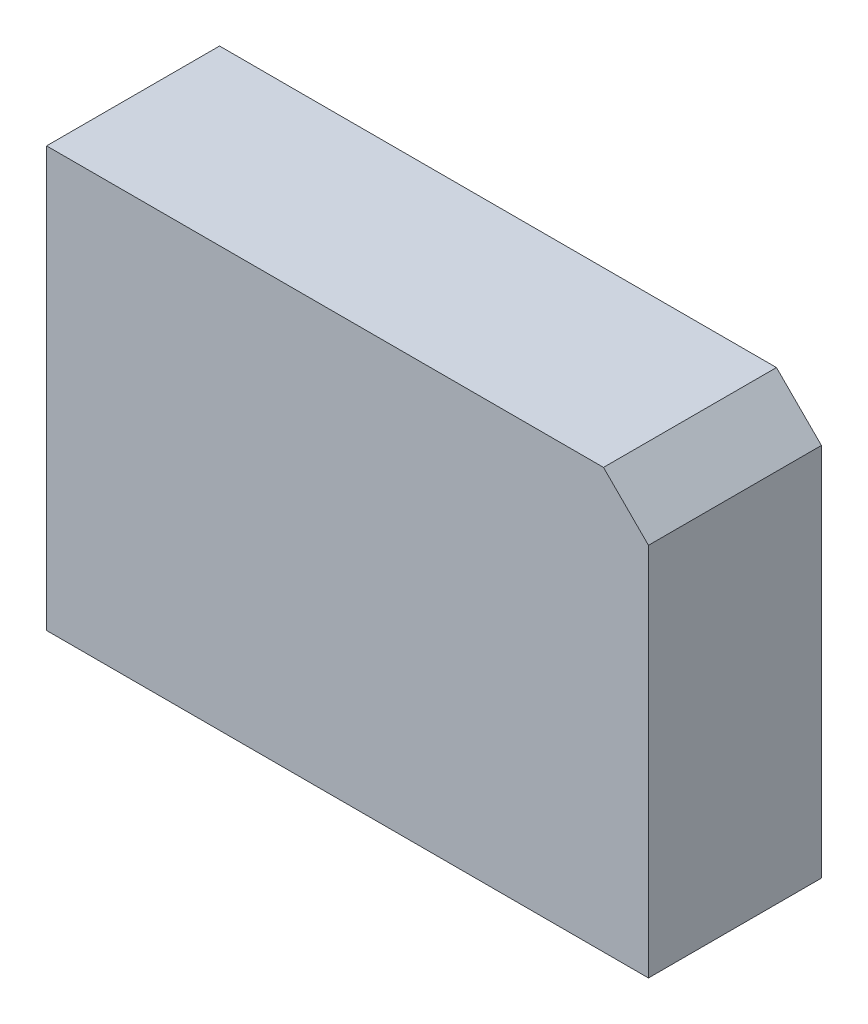
ISO-10303-21;
HEADER;
FILE_DESCRIPTION(('STEP AP214'),'2;1');
FILE_NAME('part.step','',(''),(''),'','','');
FILE_SCHEMA(('AUTOMOTIVE_DESIGN { 1 0 10303 214 1 1 1 1 }'));
ENDSEC;
DATA;
#1=APPLICATION_CONTEXT('core data for automotive mechanical design processes');
#2=APPLICATION_PROTOCOL_DEFINITION('international standard','automotive_design',2000,#1);
#3=PRODUCT_CONTEXT('',#1,'mechanical');
#4=PRODUCT('Part','Part','',(#3));
#5=PRODUCT_RELATED_PRODUCT_CATEGORY('part','',(#4));
#6=PRODUCT_DEFINITION_FORMATION('','',#4);
#7=PRODUCT_DEFINITION_CONTEXT('part definition',#1,'design');
#8=PRODUCT_DEFINITION('design','',#6,#7);
#9=PRODUCT_DEFINITION_SHAPE('','',#8);
#10=(LENGTH_UNIT() NAMED_UNIT(*) SI_UNIT(.MILLI.,.METRE.));
#11=(NAMED_UNIT(*) PLANE_ANGLE_UNIT() SI_UNIT($,.RADIAN.));
#12=(NAMED_UNIT(*) SI_UNIT($,.STERADIAN.) SOLID_ANGLE_UNIT());
#13=UNCERTAINTY_MEASURE_WITH_UNIT(LENGTH_MEASURE(1.E-05),#10,'distance_accuracy_value','');
#14=(GEOMETRIC_REPRESENTATION_CONTEXT(3) GLOBAL_UNCERTAINTY_ASSIGNED_CONTEXT((#13)) GLOBAL_UNIT_ASSIGNED_CONTEXT((#10,
#11,#12)) REPRESENTATION_CONTEXT('',''));
#15=CARTESIAN_POINT('',(0.,0.,0.));
#16=DIRECTION('',(0.,0.,1.));
#17=DIRECTION('',(1.,0.,0.));
#18=AXIS2_PLACEMENT_3D('',#15,#16,#17);
#19=CARTESIAN_POINT('',(-21.375,-30.875,18.75));
#20=DIRECTION('',(1.,0.,0.));
#21=DIRECTION('',(0.,0.,-1.));
#22=AXIS2_PLACEMENT_3D('',#19,#20,#21);
#23=PLANE('',#22);
#24=DIRECTION('',(0.,-1.,0.));
#25=VECTOR('',#24,1.);
#26=CARTESIAN_POINT('',(-21.375,-30.875,0.));
#27=LINE('',#26,#25);
#28=CARTESIAN_POINT('',(-21.375,14.625,0.));
#29=VERTEX_POINT('',#28);
#30=CARTESIAN_POINT('',(-21.375,-30.875,0.));
#31=VERTEX_POINT('',#30);
#32=EDGE_CURVE('E113',#29,#31,#27,.T.);
#33=ORIENTED_EDGE('',*,*,#32,.T.);
#34=DIRECTION('',(0.,0.,-1.));
#35=VECTOR('',#34,1.);
#36=CARTESIAN_POINT('',(-21.375,-30.875,18.75));
#37=LINE('',#36,#35);
#38=CARTESIAN_POINT('',(-21.375,-30.875,18.75));
#39=VERTEX_POINT('',#38);
#40=EDGE_CURVE('E100',#39,#31,#37,.T.);
#41=ORIENTED_EDGE('',*,*,#40,.F.);
#42=DIRECTION('',(0.,-1.,0.));
#43=VECTOR('',#42,1.);
#44=CARTESIAN_POINT('',(-21.375,-30.875,18.75));
#45=LINE('',#44,#43);
#46=CARTESIAN_POINT('',(-21.375,14.625,18.75));
#47=VERTEX_POINT('',#46);
#48=EDGE_CURVE('E103',#47,#39,#45,.T.);
#49=ORIENTED_EDGE('',*,*,#48,.F.);
#50=DIRECTION('',(0.,0.,-1.));
#51=VECTOR('',#50,1.);
#52=CARTESIAN_POINT('',(-21.375,14.625,18.75));
#53=LINE('',#52,#51);
#54=EDGE_CURVE('E118',#47,#29,#53,.T.);
#55=ORIENTED_EDGE('',*,*,#54,.T.);
#56=EDGE_LOOP('',(#33,#41,#49,#55));
#57=FACE_BOUND('',#56,.T.);
#58=ADVANCED_FACE('F44',(#57),#23,.F.);
#59=CARTESIAN_POINT('',(-21.375,-30.875,18.75));
#60=DIRECTION('',(0.,1.,0.));
#61=DIRECTION('',(0.,0.,1.));
#62=AXIS2_PLACEMENT_3D('',#59,#60,#61);
#63=PLANE('',#62);
#64=DIRECTION('',(1.,0.,0.));
#65=VECTOR('',#64,1.);
#66=CARTESIAN_POINT('',(-21.375,-30.875,0.));
#67=LINE('',#66,#65);
#68=CARTESIAN_POINT('',(43.875,-30.875,0.));
#69=VERTEX_POINT('',#68);
#70=EDGE_CURVE('E126',#31,#69,#67,.T.);
#71=ORIENTED_EDGE('',*,*,#70,.T.);
#72=DIRECTION('',(0.,0.,-1.));
#73=VECTOR('',#72,1.);
#74=CARTESIAN_POINT('',(43.875,-30.875,18.75));
#75=LINE('',#74,#73);
#76=CARTESIAN_POINT('',(43.875,-30.875,18.75));
#77=VERTEX_POINT('',#76);
#78=EDGE_CURVE('E99',#77,#69,#75,.T.);
#79=ORIENTED_EDGE('',*,*,#78,.F.);
#80=DIRECTION('',(1.,0.,0.));
#81=VECTOR('',#80,1.);
#82=CARTESIAN_POINT('',(-21.375,-30.875,18.75));
#83=LINE('',#82,#81);
#84=EDGE_CURVE('E91',#39,#77,#83,.T.);
#85=ORIENTED_EDGE('',*,*,#84,.F.);
#86=ORIENTED_EDGE('',*,*,#40,.T.);
#87=EDGE_LOOP('',(#71,#79,#85,#86));
#88=FACE_BOUND('',#87,.T.);
#89=ADVANCED_FACE('F92',(#88),#63,.F.);
#90=CARTESIAN_POINT('',(43.875,-30.875,18.75));
#91=DIRECTION('',(-1.,0.,0.));
#92=DIRECTION('',(0.,0.,1.));
#93=AXIS2_PLACEMENT_3D('',#90,#91,#92);
#94=PLANE('',#93);
#95=DIRECTION('',(0.,1.,0.));
#96=VECTOR('',#95,1.);
#97=CARTESIAN_POINT('',(43.875,-30.875,0.));
#98=LINE('',#97,#96);
#99=CARTESIAN_POINT('',(43.875,9.74999999999997,0.));
#100=VERTEX_POINT('',#99);
#101=EDGE_CURVE('E127',#69,#100,#98,.T.);
#102=ORIENTED_EDGE('',*,*,#101,.T.);
#103=DIRECTION('',(0.,0.,1.));
#104=VECTOR('',#103,1.);
#105=CARTESIAN_POINT('',(43.875,9.74999999999997,18.75));
#106=LINE('',#105,#104);
#107=CARTESIAN_POINT('',(43.875,9.74999999999997,18.75));
#108=VERTEX_POINT('',#107);
#109=EDGE_CURVE('E53',#100,#108,#106,.T.);
#110=ORIENTED_EDGE('',*,*,#109,.T.);
#111=DIRECTION('',(0.,1.,0.));
#112=VECTOR('',#111,1.);
#113=CARTESIAN_POINT('',(43.875,-30.875,18.75));
#114=LINE('',#113,#112);
#115=EDGE_CURVE('E105',#77,#108,#114,.T.);
#116=ORIENTED_EDGE('',*,*,#115,.F.);
#117=ORIENTED_EDGE('',*,*,#78,.T.);
#118=EDGE_LOOP('',(#102,#110,#116,#117));
#119=FACE_BOUND('',#118,.T.);
#120=ADVANCED_FACE('F137',(#119),#94,.F.);
#121=CARTESIAN_POINT('',(-21.375,14.625,18.75));
#122=DIRECTION('',(0.,-1.,0.));
#123=DIRECTION('',(0.,0.,-1.));
#124=AXIS2_PLACEMENT_3D('',#121,#122,#123);
#125=PLANE('',#124);
#126=DIRECTION('',(-1.,0.,0.));
#127=VECTOR('',#126,1.);
#128=CARTESIAN_POINT('',(-21.375,14.625,18.75));
#129=LINE('',#128,#127);
#130=CARTESIAN_POINT('',(39.,14.625,18.75));
#131=VERTEX_POINT('',#130);
#132=EDGE_CURVE('E107',#131,#47,#129,.T.);
#133=ORIENTED_EDGE('',*,*,#132,.F.);
#134=DIRECTION('',(0.,0.,-1.));
#135=VECTOR('',#134,1.);
#136=CARTESIAN_POINT('',(39.,14.625,18.75));
#137=LINE('',#136,#135);
#138=CARTESIAN_POINT('',(39.,14.625,0.));
#139=VERTEX_POINT('',#138);
#140=EDGE_CURVE('E117',#131,#139,#137,.T.);
#141=ORIENTED_EDGE('',*,*,#140,.T.);
#142=DIRECTION('',(-1.,0.,0.));
#143=VECTOR('',#142,1.);
#144=CARTESIAN_POINT('',(-21.375,14.625,0.));
#145=LINE('',#144,#143);
#146=EDGE_CURVE('E115',#139,#29,#145,.T.);
#147=ORIENTED_EDGE('',*,*,#146,.T.);
#148=ORIENTED_EDGE('',*,*,#54,.F.);
#149=EDGE_LOOP('',(#133,#141,#147,#148));
#150=FACE_BOUND('',#149,.T.);
#151=ADVANCED_FACE('F136',(#150),#125,.F.);
#152=CARTESIAN_POINT('',(0.,0.,18.75));
#153=DIRECTION('',(0.,0.,-1.));
#154=DIRECTION('',(-1.,0.,0.));
#155=AXIS2_PLACEMENT_3D('',#152,#153,#154);
#156=PLANE('',#155);
#157=ORIENTED_EDGE('',*,*,#115,.T.);
#158=DIRECTION('',(0.707106781186548,-0.707106781186547,0.));
#159=VECTOR('',#158,1.);
#160=CARTESIAN_POINT('',(39.,14.625,18.75));
#161=LINE('',#160,#159);
#162=EDGE_CURVE('E11',#108,#131,#161,.F.);
#163=ORIENTED_EDGE('',*,*,#162,.T.);
#164=ORIENTED_EDGE('',*,*,#132,.T.);
#165=ORIENTED_EDGE('',*,*,#48,.T.);
#166=ORIENTED_EDGE('',*,*,#84,.T.);
#167=EDGE_LOOP('',(#157,#163,#164,#165,#166));
#168=FACE_BOUND('',#167,.T.);
#169=ADVANCED_FACE('F106',(#168),#156,.F.);
#170=CARTESIAN_POINT('',(0.,0.,0.));
#171=DIRECTION('',(0.,0.,-1.));
#172=DIRECTION('',(-1.,0.,0.));
#173=AXIS2_PLACEMENT_3D('',#170,#171,#172);
#174=PLANE('',#173);
#175=ORIENTED_EDGE('',*,*,#146,.F.);
#176=DIRECTION('',(-0.707106781186548,0.707106781186547,0.));
#177=VECTOR('',#176,1.);
#178=CARTESIAN_POINT('',(26.8125,26.8125,0.));
#179=LINE('',#178,#177);
#180=EDGE_CURVE('E67',#139,#100,#179,.F.);
#181=ORIENTED_EDGE('',*,*,#180,.T.);
#182=ORIENTED_EDGE('',*,*,#101,.F.);
#183=ORIENTED_EDGE('',*,*,#70,.F.);
#184=ORIENTED_EDGE('',*,*,#32,.F.);
#185=EDGE_LOOP('',(#175,#181,#182,#183,#184));
#186=FACE_BOUND('',#185,.T.);
#187=ADVANCED_FACE('F140',(#186),#174,.T.);
#188=CARTESIAN_POINT('',(39.,14.625,18.75));
#189=DIRECTION('',(-0.707106781186547,-0.707106781186548,0.));
#190=DIRECTION('',(0.,0.,-1.));
#191=AXIS2_PLACEMENT_3D('',#188,#189,#190);
#192=PLANE('',#191);
#193=ORIENTED_EDGE('',*,*,#162,.F.);
#194=ORIENTED_EDGE('',*,*,#109,.F.);
#195=ORIENTED_EDGE('',*,*,#180,.F.);
#196=ORIENTED_EDGE('',*,*,#140,.F.);
#197=EDGE_LOOP('',(#193,#194,#195,#196));
#198=FACE_BOUND('',#197,.T.);
#199=ADVANCED_FACE('F48',(#198),#192,.F.);
#200=CLOSED_SHELL('',(#58,#89,#120,#151,#169,#187,#199));
#201=MANIFOLD_SOLID_BREP('B2',#200);
#202=ADVANCED_BREP_SHAPE_REPRESENTATION('',(#18,#201),#14);
#203=SHAPE_DEFINITION_REPRESENTATION(#9,#202);
ENDSEC;
END-ISO-10303-21;
